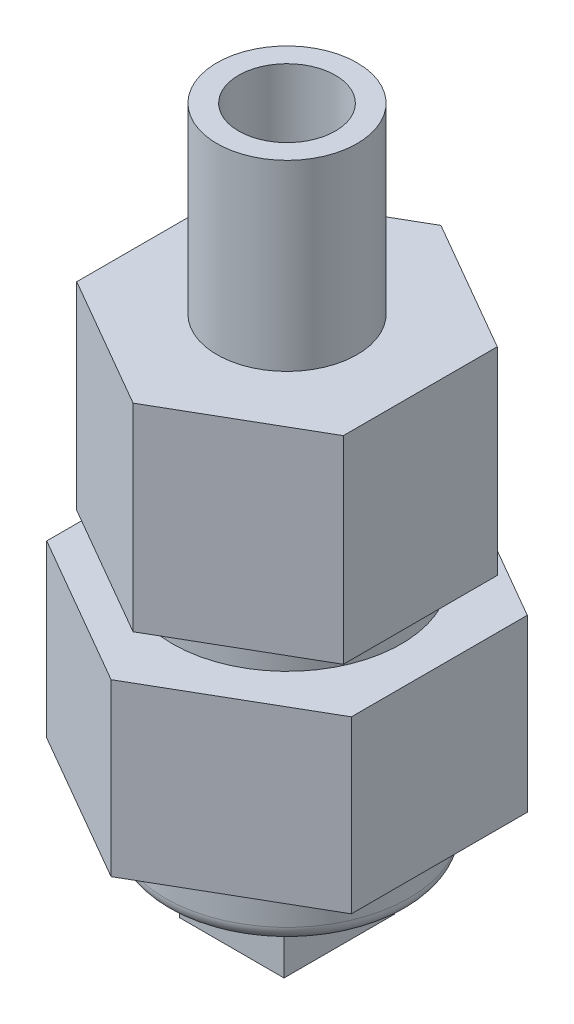
ISO-10303-21;
HEADER;
FILE_DESCRIPTION(('STEP AP214'),'2;1');
FILE_NAME('part.step','',(''),(''),'','','');
FILE_SCHEMA(('AUTOMOTIVE_DESIGN { 1 0 10303 214 1 1 1 1 }'));
ENDSEC;
DATA;
#1=APPLICATION_CONTEXT('core data for automotive mechanical design processes');
#2=APPLICATION_PROTOCOL_DEFINITION('international standard','automotive_design',2000,#1);
#3=PRODUCT_CONTEXT('',#1,'mechanical');
#4=PRODUCT('Part','Part','',(#3));
#5=PRODUCT_RELATED_PRODUCT_CATEGORY('part','',(#4));
#6=PRODUCT_DEFINITION_FORMATION('','',#4);
#7=PRODUCT_DEFINITION_CONTEXT('part definition',#1,'design');
#8=PRODUCT_DEFINITION('design','',#6,#7);
#9=PRODUCT_DEFINITION_SHAPE('','',#8);
#10=(LENGTH_UNIT() NAMED_UNIT(*) SI_UNIT(.MILLI.,.METRE.));
#11=(NAMED_UNIT(*) PLANE_ANGLE_UNIT() SI_UNIT($,.RADIAN.));
#12=(NAMED_UNIT(*) SI_UNIT($,.STERADIAN.) SOLID_ANGLE_UNIT());
#13=UNCERTAINTY_MEASURE_WITH_UNIT(LENGTH_MEASURE(1.E-05),#10,'distance_accuracy_value','');
#14=(GEOMETRIC_REPRESENTATION_CONTEXT(3) GLOBAL_UNCERTAINTY_ASSIGNED_CONTEXT((#13)) GLOBAL_UNIT_ASSIGNED_CONTEXT((#10,
#11,#12)) REPRESENTATION_CONTEXT('',''));
#15=CARTESIAN_POINT('',(0.,0.,0.));
#16=DIRECTION('',(0.,0.,1.));
#17=DIRECTION('',(1.,0.,0.));
#18=AXIS2_PLACEMENT_3D('',#15,#16,#17);
#19=CARTESIAN_POINT('',(0.,0.,0.));
#20=DIRECTION('',(0.,1.,0.));
#21=DIRECTION('',(0.,0.,1.));
#22=AXIS2_PLACEMENT_3D('',#19,#20,#21);
#23=PLANE('',#22);
#24=CARTESIAN_POINT('',(0.,0.,0.));
#25=DIRECTION('',(0.,1.,0.));
#26=DIRECTION('',(0.,0.,1.));
#27=AXIS2_PLACEMENT_3D('',#24,#25,#26);
#28=CIRCLE('',#27,8.);
#29=CARTESIAN_POINT('',(0.,0.,8.));
#30=VERTEX_POINT('',#29);
#31=EDGE_CURVE('E380',#30,#30,#28,.F.);
#32=ORIENTED_EDGE('',*,*,#31,.F.);
#33=EDGE_LOOP('',(#32));
#34=FACE_BOUND('',#33,.T.);
#35=DIRECTION('',(0.,0.,1.));
#36=VECTOR('',#35,1.);
#37=CARTESIAN_POINT('',(9.99999999999999,0.,5.77350269189626));
#38=LINE('',#37,#36);
#39=CARTESIAN_POINT('',(9.99999999999999,0.,-5.77350269189626));
#40=VERTEX_POINT('',#39);
#41=CARTESIAN_POINT('',(10.,0.,5.77350269189626));
#42=VERTEX_POINT('',#41);
#43=EDGE_CURVE('E158',#40,#42,#38,.T.);
#44=ORIENTED_EDGE('',*,*,#43,.T.);
#45=DIRECTION('',(-0.866025403784439,0.,0.5));
#46=VECTOR('',#45,1.);
#47=CARTESIAN_POINT('',(0.,0.,11.5470053837925));
#48=LINE('',#47,#46);
#49=CARTESIAN_POINT('',(0.,0.,11.5470053837925));
#50=VERTEX_POINT('',#49);
#51=EDGE_CURVE('E416',#42,#50,#48,.T.);
#52=ORIENTED_EDGE('',*,*,#51,.T.);
#53=DIRECTION('',(-0.866025403784439,0.,-0.5));
#54=VECTOR('',#53,1.);
#55=CARTESIAN_POINT('',(-10.,0.,5.77350269189626));
#56=LINE('',#55,#54);
#57=CARTESIAN_POINT('',(-10.,0.,5.77350269189626));
#58=VERTEX_POINT('',#57);
#59=EDGE_CURVE('E408',#50,#58,#56,.T.);
#60=ORIENTED_EDGE('',*,*,#59,.T.);
#61=DIRECTION('',(0.,0.,-1.));
#62=VECTOR('',#61,1.);
#63=CARTESIAN_POINT('',(-10.,0.,-5.77350269189626));
#64=LINE('',#63,#62);
#65=CARTESIAN_POINT('',(-10.,0.,-5.77350269189626));
#66=VERTEX_POINT('',#65);
#67=EDGE_CURVE('E400',#58,#66,#64,.T.);
#68=ORIENTED_EDGE('',*,*,#67,.T.);
#69=DIRECTION('',(0.866025403784439,0.,-0.5));
#70=VECTOR('',#69,1.);
#71=CARTESIAN_POINT('',(0.,0.,-11.5470053837925));
#72=LINE('',#71,#70);
#73=CARTESIAN_POINT('',(0.,0.,-11.5470053837925));
#74=VERTEX_POINT('',#73);
#75=EDGE_CURVE('E390',#66,#74,#72,.T.);
#76=ORIENTED_EDGE('',*,*,#75,.T.);
#77=DIRECTION('',(0.866025403784439,0.,0.5));
#78=VECTOR('',#77,1.);
#79=CARTESIAN_POINT('',(9.99999999999999,0.,-5.77350269189626));
#80=LINE('',#79,#78);
#81=EDGE_CURVE('E337',#74,#40,#80,.T.);
#82=ORIENTED_EDGE('',*,*,#81,.T.);
#83=EDGE_LOOP('',(#44,#52,#60,#68,#76,#82));
#84=FACE_BOUND('',#83,.T.);
#85=ADVANCED_FACE('F17',(#34,#84),#23,.F.);
#86=CARTESIAN_POINT('',(0.,-4.,0.));
#87=DIRECTION('',(0.,1.,0.));
#88=DIRECTION('',(0.,0.,1.));
#89=AXIS2_PLACEMENT_3D('',#86,#87,#88);
#90=CYLINDRICAL_SURFACE('',#89,8.);
#91=CARTESIAN_POINT('',(0.,-3.,0.));
#92=DIRECTION('',(0.,-1.,0.));
#93=DIRECTION('',(0.,0.,-1.));
#94=AXIS2_PLACEMENT_3D('',#91,#92,#93);
#95=CIRCLE('',#94,8.);
#96=CARTESIAN_POINT('',(0.,-3.,-8.));
#97=VERTEX_POINT('',#96);
#98=EDGE_CURVE('E325',#97,#97,#95,.T.);
#99=ORIENTED_EDGE('',*,*,#98,.F.);
#100=EDGE_LOOP('',(#99));
#101=FACE_BOUND('',#100,.T.);
#102=ORIENTED_EDGE('',*,*,#31,.T.);
#103=EDGE_LOOP('',(#102));
#104=FACE_BOUND('',#103,.T.);
#105=ADVANCED_FACE('F195',(#101,#104),#90,.T.);
#106=CARTESIAN_POINT('',(9.99999999999999,11.2,-5.77350269189626));
#107=DIRECTION('',(-0.5,0.,0.866025403784439));
#108=DIRECTION('',(0.866025403784439,0.,0.5));
#109=AXIS2_PLACEMENT_3D('',#106,#107,#108);
#110=PLANE('',#109);
#111=DIRECTION('',(0.,1.,0.));
#112=VECTOR('',#111,1.);
#113=CARTESIAN_POINT('',(0.,11.2,-11.5470053837925));
#114=LINE('',#113,#112);
#115=CARTESIAN_POINT('',(0.,11.2,-11.5470053837925));
#116=VERTEX_POINT('',#115);
#117=EDGE_CURVE('E385',#74,#116,#114,.T.);
#118=ORIENTED_EDGE('',*,*,#117,.T.);
#119=DIRECTION('',(-0.866025403784439,0.,-0.5));
#120=VECTOR('',#119,1.);
#121=CARTESIAN_POINT('',(9.99999999999999,11.2,-5.77350269189626));
#122=LINE('',#121,#120);
#123=CARTESIAN_POINT('',(9.99999999999999,11.2,-5.77350269189626));
#124=VERTEX_POINT('',#123);
#125=EDGE_CURVE('E323',#124,#116,#122,.T.);
#126=ORIENTED_EDGE('',*,*,#125,.F.);
#127=DIRECTION('',(0.,1.,0.));
#128=VECTOR('',#127,1.);
#129=CARTESIAN_POINT('',(9.99999999999999,11.2,-5.77350269189626));
#130=LINE('',#129,#128);
#131=EDGE_CURVE('E335',#124,#40,#130,.F.);
#132=ORIENTED_EDGE('',*,*,#131,.T.);
#133=ORIENTED_EDGE('',*,*,#81,.F.);
#134=EDGE_LOOP('',(#118,#126,#132,#133));
#135=FACE_BOUND('',#134,.T.);
#136=ADVANCED_FACE('F192',(#135),#110,.F.);
#137=CARTESIAN_POINT('',(0.,11.2,-11.5470053837925));
#138=DIRECTION('',(0.5,0.,0.866025403784439));
#139=DIRECTION('',(0.866025403784439,0.,-0.5));
#140=AXIS2_PLACEMENT_3D('',#137,#138,#139);
#141=PLANE('',#140);
#142=DIRECTION('',(0.,1.,0.));
#143=VECTOR('',#142,1.);
#144=CARTESIAN_POINT('',(-10.,11.2,-5.77350269189626));
#145=LINE('',#144,#143);
#146=CARTESIAN_POINT('',(-10.,11.2,-5.77350269189626));
#147=VERTEX_POINT('',#146);
#148=EDGE_CURVE('E394',#66,#147,#145,.T.);
#149=ORIENTED_EDGE('',*,*,#148,.T.);
#150=DIRECTION('',(-0.866025403784438,0.,0.5));
#151=VECTOR('',#150,1.);
#152=CARTESIAN_POINT('',(0.,11.2,-11.5470053837925));
#153=LINE('',#152,#151);
#154=EDGE_CURVE('E321',#116,#147,#153,.T.);
#155=ORIENTED_EDGE('',*,*,#154,.F.);
#156=ORIENTED_EDGE('',*,*,#117,.F.);
#157=ORIENTED_EDGE('',*,*,#75,.F.);
#158=EDGE_LOOP('',(#149,#155,#156,#157));
#159=FACE_BOUND('',#158,.T.);
#160=ADVANCED_FACE('F188',(#159),#141,.F.);
#161=CARTESIAN_POINT('',(-10.,11.2,-5.77350269189626));
#162=DIRECTION('',(1.,0.,0.));
#163=DIRECTION('',(0.,0.,-1.));
#164=AXIS2_PLACEMENT_3D('',#161,#162,#163);
#165=PLANE('',#164);
#166=DIRECTION('',(0.,1.,0.));
#167=VECTOR('',#166,1.);
#168=CARTESIAN_POINT('',(-10.,11.2,5.77350269189626));
#169=LINE('',#168,#167);
#170=CARTESIAN_POINT('',(-10.,11.2,5.77350269189626));
#171=VERTEX_POINT('',#170);
#172=EDGE_CURVE('E404',#58,#171,#169,.T.);
#173=ORIENTED_EDGE('',*,*,#172,.T.);
#174=DIRECTION('',(0.,0.,1.));
#175=VECTOR('',#174,1.);
#176=CARTESIAN_POINT('',(-10.,11.2,0.));
#177=LINE('',#176,#175);
#178=EDGE_CURVE('E318',#147,#171,#177,.T.);
#179=ORIENTED_EDGE('',*,*,#178,.F.);
#180=ORIENTED_EDGE('',*,*,#148,.F.);
#181=ORIENTED_EDGE('',*,*,#67,.F.);
#182=EDGE_LOOP('',(#173,#179,#180,#181));
#183=FACE_BOUND('',#182,.T.);
#184=ADVANCED_FACE('F184',(#183),#165,.F.);
#185=CARTESIAN_POINT('',(-10.,11.2,5.77350269189626));
#186=DIRECTION('',(0.5,0.,-0.866025403784439));
#187=DIRECTION('',(-0.866025403784439,0.,-0.5));
#188=AXIS2_PLACEMENT_3D('',#185,#186,#187);
#189=PLANE('',#188);
#190=DIRECTION('',(0.,1.,0.));
#191=VECTOR('',#190,1.);
#192=CARTESIAN_POINT('',(0.,11.2,11.5470053837925));
#193=LINE('',#192,#191);
#194=CARTESIAN_POINT('',(0.,11.2,11.5470053837925));
#195=VERTEX_POINT('',#194);
#196=EDGE_CURVE('E412',#50,#195,#193,.T.);
#197=ORIENTED_EDGE('',*,*,#196,.T.);
#198=DIRECTION('',(0.866025403784439,0.,0.5));
#199=VECTOR('',#198,1.);
#200=CARTESIAN_POINT('',(-10.,11.2,5.77350269189626));
#201=LINE('',#200,#199);
#202=EDGE_CURVE('E315',#171,#195,#201,.T.);
#203=ORIENTED_EDGE('',*,*,#202,.F.);
#204=ORIENTED_EDGE('',*,*,#172,.F.);
#205=ORIENTED_EDGE('',*,*,#59,.F.);
#206=EDGE_LOOP('',(#197,#203,#204,#205));
#207=FACE_BOUND('',#206,.T.);
#208=ADVANCED_FACE('F180',(#207),#189,.F.);
#209=CARTESIAN_POINT('',(0.,11.2,11.5470053837925));
#210=DIRECTION('',(-0.5,0.,-0.866025403784439));
#211=DIRECTION('',(-0.866025403784439,0.,0.5));
#212=AXIS2_PLACEMENT_3D('',#209,#210,#211);
#213=PLANE('',#212);
#214=DIRECTION('',(0.,1.,0.));
#215=VECTOR('',#214,1.);
#216=CARTESIAN_POINT('',(9.99999999999999,11.2,5.77350269189626));
#217=LINE('',#216,#215);
#218=CARTESIAN_POINT('',(9.99999999999999,11.2,5.77350269189626));
#219=VERTEX_POINT('',#218);
#220=EDGE_CURVE('E420',#42,#219,#217,.T.);
#221=ORIENTED_EDGE('',*,*,#220,.T.);
#222=DIRECTION('',(0.866025403784438,0.,-0.5));
#223=VECTOR('',#222,1.);
#224=CARTESIAN_POINT('',(0.,11.2,11.5470053837925));
#225=LINE('',#224,#223);
#226=EDGE_CURVE('E312',#195,#219,#225,.T.);
#227=ORIENTED_EDGE('',*,*,#226,.F.);
#228=ORIENTED_EDGE('',*,*,#196,.F.);
#229=ORIENTED_EDGE('',*,*,#51,.F.);
#230=EDGE_LOOP('',(#221,#227,#228,#229));
#231=FACE_BOUND('',#230,.T.);
#232=ADVANCED_FACE('F176',(#231),#213,.F.);
#233=CARTESIAN_POINT('',(9.99999999999999,11.2,5.77350269189626));
#234=DIRECTION('',(-1.,0.,0.));
#235=DIRECTION('',(0.,0.,1.));
#236=AXIS2_PLACEMENT_3D('',#233,#234,#235);
#237=PLANE('',#236);
#238=ORIENTED_EDGE('',*,*,#131,.F.);
#239=DIRECTION('',(0.,0.,1.));
#240=VECTOR('',#239,1.);
#241=CARTESIAN_POINT('',(9.99999999999999,11.2,0.));
#242=LINE('',#241,#240);
#243=EDGE_CURVE('E144',#219,#124,#242,.F.);
#244=ORIENTED_EDGE('',*,*,#243,.F.);
#245=ORIENTED_EDGE('',*,*,#220,.F.);
#246=ORIENTED_EDGE('',*,*,#43,.F.);
#247=EDGE_LOOP('',(#238,#244,#245,#246));
#248=FACE_BOUND('',#247,.T.);
#249=ADVANCED_FACE('F170',(#248),#237,.F.);
#250=CARTESIAN_POINT('',(0.,-3.,0.));
#251=DIRECTION('',(0.,-1.,0.));
#252=DIRECTION('',(0.,0.,-1.));
#253=AXIS2_PLACEMENT_3D('',#250,#251,#252);
#254=TOROIDAL_SURFACE('',#253,7.,1.);
#255=ORIENTED_EDGE('',*,*,#98,.T.);
#256=EDGE_LOOP('',(#255));
#257=FACE_BOUND('',#256,.T.);
#258=CARTESIAN_POINT('',(0.,-4.,0.));
#259=DIRECTION('',(0.,1.,0.));
#260=DIRECTION('',(0.,0.,-1.));
#261=AXIS2_PLACEMENT_3D('',#258,#259,#260);
#262=CIRCLE('',#261,7.);
#263=CARTESIAN_POINT('',(0.,-4.,7.));
#264=VERTEX_POINT('',#263);
#265=CARTESIAN_POINT('',(0.,-4.,-7.));
#266=VERTEX_POINT('',#265);
#267=EDGE_CURVE('E136',#264,#266,#262,.F.);
#268=ORIENTED_EDGE('',*,*,#267,.F.);
#269=CARTESIAN_POINT('',(0.,-4.,0.));
#270=DIRECTION('',(0.,1.,0.));
#271=DIRECTION('',(0.,0.,1.));
#272=AXIS2_PLACEMENT_3D('',#269,#270,#271);
#273=CIRCLE('',#272,7.);
#274=EDGE_CURVE('E139',#266,#264,#273,.F.);
#275=ORIENTED_EDGE('',*,*,#274,.F.);
#276=EDGE_LOOP('',(#268,#275));
#277=FACE_BOUND('',#276,.T.);
#278=ADVANCED_FACE('F148',(#257,#277),#254,.T.);
#279=CARTESIAN_POINT('',(0.,11.2,0.));
#280=DIRECTION('',(0.,1.,0.));
#281=DIRECTION('',(0.,0.,1.));
#282=AXIS2_PLACEMENT_3D('',#279,#280,#281);
#283=PLANE('',#282);
#284=CARTESIAN_POINT('',(0.,11.2,0.));
#285=DIRECTION('',(0.,-1.,0.));
#286=DIRECTION('',(0.,0.,-1.));
#287=AXIS2_PLACEMENT_3D('',#284,#285,#286);
#288=CIRCLE('',#287,7.5);
#289=CARTESIAN_POINT('',(0.,11.2,-7.5));
#290=VERTEX_POINT('',#289);
#291=EDGE_CURVE('E150',#290,#290,#288,.F.);
#292=ORIENTED_EDGE('',*,*,#291,.F.);
#293=EDGE_LOOP('',(#292));
#294=FACE_BOUND('',#293,.T.);
#295=ORIENTED_EDGE('',*,*,#226,.T.);
#296=ORIENTED_EDGE('',*,*,#243,.T.);
#297=ORIENTED_EDGE('',*,*,#125,.T.);
#298=ORIENTED_EDGE('',*,*,#154,.T.);
#299=ORIENTED_EDGE('',*,*,#178,.T.);
#300=ORIENTED_EDGE('',*,*,#202,.T.);
#301=EDGE_LOOP('',(#295,#296,#297,#298,#299,#300));
#302=FACE_BOUND('',#301,.T.);
#303=ADVANCED_FACE('F169',(#294,#302),#283,.T.);
#304=CARTESIAN_POINT('',(0.,-4.,0.));
#305=DIRECTION('',(0.,-1.,0.));
#306=DIRECTION('',(0.,0.,-1.));
#307=AXIS2_PLACEMENT_3D('',#304,#305,#306);
#308=PLANE('',#307);
#309=DIRECTION('',(-1.,0.,0.));
#310=VECTOR('',#309,1.);
#311=CARTESIAN_POINT('',(3.43638652434224,-4.,3.63197572339341));
#312=LINE('',#311,#310);
#313=CARTESIAN_POINT('',(-3.43638652434224,-4.,3.63197572339341));
#314=VERTEX_POINT('',#313);
#315=CARTESIAN_POINT('',(3.43638652434224,-4.,3.63197572339341));
#316=VERTEX_POINT('',#315);
#317=EDGE_CURVE('E375',#314,#316,#312,.F.);
#318=ORIENTED_EDGE('',*,*,#317,.T.);
#319=DIRECTION('',(0.,0.,1.));
#320=VECTOR('',#319,1.);
#321=CARTESIAN_POINT('',(3.43638652434224,-4.,-3.63197572339341));
#322=LINE('',#321,#320);
#323=CARTESIAN_POINT('',(3.43638652434224,-4.,-3.63197572339341));
#324=VERTEX_POINT('',#323);
#325=EDGE_CURVE('E655',#316,#324,#322,.F.);
#326=ORIENTED_EDGE('',*,*,#325,.T.);
#327=DIRECTION('',(1.,0.,0.));
#328=VECTOR('',#327,1.);
#329=CARTESIAN_POINT('',(3.43638652434224,-4.,-3.63197572339341));
#330=LINE('',#329,#328);
#331=CARTESIAN_POINT('',(-3.43638652434224,-4.,-3.63197572339341));
#332=VERTEX_POINT('',#331);
#333=EDGE_CURVE('E646',#324,#332,#330,.F.);
#334=ORIENTED_EDGE('',*,*,#333,.T.);
#335=DIRECTION('',(0.,0.,-1.));
#336=VECTOR('',#335,1.);
#337=CARTESIAN_POINT('',(-3.43638652434224,-4.,-3.63197572339341));
#338=LINE('',#337,#336);
#339=EDGE_CURVE('E379',#332,#314,#338,.F.);
#340=ORIENTED_EDGE('',*,*,#339,.T.);
#341=EDGE_LOOP('',(#318,#326,#334,#340));
#342=FACE_BOUND('',#341,.T.);
#343=ORIENTED_EDGE('',*,*,#274,.T.);
#344=ORIENTED_EDGE('',*,*,#267,.T.);
#345=EDGE_LOOP('',(#343,#344));
#346=FACE_BOUND('',#345,.T.);
#347=ADVANCED_FACE('F141',(#342,#346),#308,.T.);
#348=CARTESIAN_POINT('',(0.,13.2,0.));
#349=DIRECTION('',(0.,-1.,0.));
#350=DIRECTION('',(0.,0.,-1.));
#351=AXIS2_PLACEMENT_3D('',#348,#349,#350);
#352=CYLINDRICAL_SURFACE('',#351,7.5);
#353=CARTESIAN_POINT('',(0.,13.2,0.));
#354=DIRECTION('',(0.,-1.,0.));
#355=DIRECTION('',(0.,0.,-1.));
#356=AXIS2_PLACEMENT_3D('',#353,#354,#355);
#357=CIRCLE('',#356,7.5);
#358=CARTESIAN_POINT('',(0.,13.2,-7.5));
#359=VERTEX_POINT('',#358);
#360=EDGE_CURVE('E370',#359,#359,#357,.T.);
#361=ORIENTED_EDGE('',*,*,#360,.T.);
#362=EDGE_LOOP('',(#361));
#363=FACE_BOUND('',#362,.T.);
#364=ORIENTED_EDGE('',*,*,#291,.T.);
#365=EDGE_LOOP('',(#364));
#366=FACE_BOUND('',#365,.T.);
#367=ADVANCED_FACE('F290',(#363,#366),#352,.T.);
#368=CARTESIAN_POINT('',(-3.43638652434224,-8.,-3.63197572339341));
#369=DIRECTION('',(1.,0.,0.));
#370=DIRECTION('',(0.,0.,-1.));
#371=AXIS2_PLACEMENT_3D('',#368,#369,#370);
#372=PLANE('',#371);
#373=DIRECTION('',(0.,1.,0.));
#374=VECTOR('',#373,1.);
#375=CARTESIAN_POINT('',(-3.43638652434224,-8.,-3.63197572339341));
#376=LINE('',#375,#374);
#377=CARTESIAN_POINT('',(-3.43638652434224,-8.,-3.63197572339341));
#378=VERTEX_POINT('',#377);
#379=EDGE_CURVE('E640',#332,#378,#376,.F.);
#380=ORIENTED_EDGE('',*,*,#379,.T.);
#381=DIRECTION('',(0.,0.,-1.));
#382=VECTOR('',#381,1.);
#383=CARTESIAN_POINT('',(-3.43638652434224,-8.,0.));
#384=LINE('',#383,#382);
#385=CARTESIAN_POINT('',(-3.43638652434224,-8.,3.63197572339341));
#386=VERTEX_POINT('',#385);
#387=EDGE_CURVE('E374',#386,#378,#384,.T.);
#388=ORIENTED_EDGE('',*,*,#387,.F.);
#389=DIRECTION('',(0.,1.,0.));
#390=VECTOR('',#389,1.);
#391=CARTESIAN_POINT('',(-3.43638652434224,-8.,3.63197572339341));
#392=LINE('',#391,#390);
#393=EDGE_CURVE('E663',#386,#314,#392,.T.);
#394=ORIENTED_EDGE('',*,*,#393,.T.);
#395=ORIENTED_EDGE('',*,*,#339,.F.);
#396=EDGE_LOOP('',(#380,#388,#394,#395));
#397=FACE_BOUND('',#396,.T.);
#398=ADVANCED_FACE('F286',(#397),#372,.F.);
#399=CARTESIAN_POINT('',(3.43638652434224,-8.,-3.63197572339341));
#400=DIRECTION('',(0.,0.,1.));
#401=DIRECTION('',(1.,0.,0.));
#402=AXIS2_PLACEMENT_3D('',#399,#400,#401);
#403=PLANE('',#402);
#404=DIRECTION('',(0.,1.,0.));
#405=VECTOR('',#404,1.);
#406=CARTESIAN_POINT('',(3.43638652434224,-8.,-3.63197572339341));
#407=LINE('',#406,#405);
#408=CARTESIAN_POINT('',(3.43638652434224,-8.,-3.63197572339341));
#409=VERTEX_POINT('',#408);
#410=EDGE_CURVE('E651',#324,#409,#407,.F.);
#411=ORIENTED_EDGE('',*,*,#410,.T.);
#412=DIRECTION('',(1.,0.,0.));
#413=VECTOR('',#412,1.);
#414=CARTESIAN_POINT('',(0.,-8.,-3.63197572339341));
#415=LINE('',#414,#413);
#416=EDGE_CURVE('E671',#378,#409,#415,.T.);
#417=ORIENTED_EDGE('',*,*,#416,.F.);
#418=ORIENTED_EDGE('',*,*,#379,.F.);
#419=ORIENTED_EDGE('',*,*,#333,.F.);
#420=EDGE_LOOP('',(#411,#417,#418,#419));
#421=FACE_BOUND('',#420,.T.);
#422=ADVANCED_FACE('F282',(#421),#403,.F.);
#423=CARTESIAN_POINT('',(3.43638652434224,-8.,-3.63197572339341));
#424=DIRECTION('',(-1.,0.,0.));
#425=DIRECTION('',(0.,0.,1.));
#426=AXIS2_PLACEMENT_3D('',#423,#424,#425);
#427=PLANE('',#426);
#428=DIRECTION('',(0.,1.,0.));
#429=VECTOR('',#428,1.);
#430=CARTESIAN_POINT('',(3.43638652434224,-8.,3.63197572339341));
#431=LINE('',#430,#429);
#432=CARTESIAN_POINT('',(3.43638652434224,-8.,3.63197572339341));
#433=VERTEX_POINT('',#432);
#434=EDGE_CURVE('E659',#316,#433,#431,.F.);
#435=ORIENTED_EDGE('',*,*,#434,.T.);
#436=DIRECTION('',(0.,0.,-1.));
#437=VECTOR('',#436,1.);
#438=CARTESIAN_POINT('',(3.43638652434224,-8.,0.));
#439=LINE('',#438,#437);
#440=EDGE_CURVE('E674',#409,#433,#439,.F.);
#441=ORIENTED_EDGE('',*,*,#440,.F.);
#442=ORIENTED_EDGE('',*,*,#410,.F.);
#443=ORIENTED_EDGE('',*,*,#325,.F.);
#444=EDGE_LOOP('',(#435,#441,#442,#443));
#445=FACE_BOUND('',#444,.T.);
#446=ADVANCED_FACE('F278',(#445),#427,.F.);
#447=CARTESIAN_POINT('',(3.43638652434224,-8.,3.63197572339341));
#448=DIRECTION('',(0.,0.,-1.));
#449=DIRECTION('',(-1.,0.,0.));
#450=AXIS2_PLACEMENT_3D('',#447,#448,#449);
#451=PLANE('',#450);
#452=ORIENTED_EDGE('',*,*,#393,.F.);
#453=DIRECTION('',(1.,0.,0.));
#454=VECTOR('',#453,1.);
#455=CARTESIAN_POINT('',(0.,-8.,3.63197572339341));
#456=LINE('',#455,#454);
#457=EDGE_CURVE('E677',#433,#386,#456,.F.);
#458=ORIENTED_EDGE('',*,*,#457,.F.);
#459=ORIENTED_EDGE('',*,*,#434,.F.);
#460=ORIENTED_EDGE('',*,*,#317,.F.);
#461=EDGE_LOOP('',(#452,#458,#459,#460));
#462=FACE_BOUND('',#461,.T.);
#463=ADVANCED_FACE('F274',(#462),#451,.F.);
#464=CARTESIAN_POINT('',(0.,13.2,0.));
#465=DIRECTION('',(0.,1.,0.));
#466=DIRECTION('',(0.,0.,1.));
#467=AXIS2_PLACEMENT_3D('',#464,#465,#466);
#468=PLANE('',#467);
#469=ORIENTED_EDGE('',*,*,#360,.F.);
#470=EDGE_LOOP('',(#469));
#471=FACE_BOUND('',#470,.T.);
#472=DIRECTION('',(0.,0.,1.));
#473=VECTOR('',#472,1.);
#474=CARTESIAN_POINT('',(8.75,13.2,5.05181485540923));
#475=LINE('',#474,#473);
#476=CARTESIAN_POINT('',(8.75,13.2,-5.05181485540923));
#477=VERTEX_POINT('',#476);
#478=CARTESIAN_POINT('',(8.75,13.2,5.05181485540923));
#479=VERTEX_POINT('',#478);
#480=EDGE_CURVE('E369',#477,#479,#475,.T.);
#481=ORIENTED_EDGE('',*,*,#480,.T.);
#482=DIRECTION('',(-0.866025403784439,0.,0.5));
#483=VECTOR('',#482,1.);
#484=CARTESIAN_POINT('',(0.,13.2,10.1036297108185));
#485=LINE('',#484,#483);
#486=CARTESIAN_POINT('',(0.,13.2,10.1036297108185));
#487=VERTEX_POINT('',#486);
#488=EDGE_CURVE('E712',#479,#487,#485,.T.);
#489=ORIENTED_EDGE('',*,*,#488,.T.);
#490=DIRECTION('',(-0.866025403784439,0.,-0.5));
#491=VECTOR('',#490,1.);
#492=CARTESIAN_POINT('',(-8.75,13.2,5.05181485540923));
#493=LINE('',#492,#491);
#494=CARTESIAN_POINT('',(-8.75,13.2,5.05181485540923));
#495=VERTEX_POINT('',#494);
#496=EDGE_CURVE('E704',#487,#495,#493,.T.);
#497=ORIENTED_EDGE('',*,*,#496,.T.);
#498=DIRECTION('',(0.,0.,-1.));
#499=VECTOR('',#498,1.);
#500=CARTESIAN_POINT('',(-8.75,13.2,-5.05181485540923));
#501=LINE('',#500,#499);
#502=CARTESIAN_POINT('',(-8.75,13.2,-5.05181485540923));
#503=VERTEX_POINT('',#502);
#504=EDGE_CURVE('E696',#495,#503,#501,.T.);
#505=ORIENTED_EDGE('',*,*,#504,.T.);
#506=DIRECTION('',(0.866025403784439,0.,-0.5));
#507=VECTOR('',#506,1.);
#508=CARTESIAN_POINT('',(0.,13.2,-10.1036297108185));
#509=LINE('',#508,#507);
#510=CARTESIAN_POINT('',(0.,13.2,-10.1036297108185));
#511=VERTEX_POINT('',#510);
#512=EDGE_CURVE('E688',#503,#511,#509,.T.);
#513=ORIENTED_EDGE('',*,*,#512,.T.);
#514=DIRECTION('',(0.866025403784439,0.,0.5));
#515=VECTOR('',#514,1.);
#516=CARTESIAN_POINT('',(8.74999999999999,13.2,-5.05181485540923));
#517=LINE('',#516,#515);
#518=EDGE_CURVE('E681',#511,#477,#517,.T.);
#519=ORIENTED_EDGE('',*,*,#518,.T.);
#520=EDGE_LOOP('',(#481,#489,#497,#505,#513,#519));
#521=FACE_BOUND('',#520,.T.);
#522=ADVANCED_FACE('F270',(#471,#521),#468,.F.);
#523=CARTESIAN_POINT('',(0.,-8.,0.));
#524=DIRECTION('',(0.,-1.,0.));
#525=DIRECTION('',(0.,0.,-1.));
#526=AXIS2_PLACEMENT_3D('',#523,#524,#525);
#527=PLANE('',#526);
#528=ORIENTED_EDGE('',*,*,#440,.T.);
#529=ORIENTED_EDGE('',*,*,#457,.T.);
#530=ORIENTED_EDGE('',*,*,#387,.T.);
#531=ORIENTED_EDGE('',*,*,#416,.T.);
#532=EDGE_LOOP('',(#528,#529,#530,#531));
#533=FACE_BOUND('',#532,.T.);
#534=CARTESIAN_POINT('',(0.,-8.,0.));
#535=DIRECTION('',(0.,-1.,0.));
#536=DIRECTION('',(0.,0.,-1.));
#537=AXIS2_PLACEMENT_3D('',#534,#535,#536);
#538=CIRCLE('',#537,0.5969);
#539=CARTESIAN_POINT('',(0.,-8.,-0.5969));
#540=VERTEX_POINT('',#539);
#541=EDGE_CURVE('E364',#540,#540,#538,.F.);
#542=ORIENTED_EDGE('',*,*,#541,.T.);
#543=EDGE_LOOP('',(#542));
#544=FACE_BOUND('',#543,.T.);
#545=ADVANCED_FACE('F266',(#533,#544),#527,.T.);
#546=CARTESIAN_POINT('',(8.74999999999999,26.2,-5.05181485540923));
#547=DIRECTION('',(-0.5,0.,0.866025403784439));
#548=DIRECTION('',(0.866025403784439,0.,0.5));
#549=AXIS2_PLACEMENT_3D('',#546,#547,#548);
#550=PLANE('',#549);
#551=DIRECTION('',(0.,1.,0.));
#552=VECTOR('',#551,1.);
#553=CARTESIAN_POINT('',(0.,26.2,-10.1036297108185));
#554=LINE('',#553,#552);
#555=CARTESIAN_POINT('',(0.,26.2,-10.1036297108185));
#556=VERTEX_POINT('',#555);
#557=EDGE_CURVE('E684',#511,#556,#554,.T.);
#558=ORIENTED_EDGE('',*,*,#557,.T.);
#559=DIRECTION('',(-0.866025403784439,0.,-0.5));
#560=VECTOR('',#559,1.);
#561=CARTESIAN_POINT('',(8.74999999999999,26.2,-5.05181485540923));
#562=LINE('',#561,#560);
#563=CARTESIAN_POINT('',(8.75,26.2,-5.05181485540923));
#564=VERTEX_POINT('',#563);
#565=EDGE_CURVE('E368',#564,#556,#562,.T.);
#566=ORIENTED_EDGE('',*,*,#565,.F.);
#567=DIRECTION('',(0.,1.,0.));
#568=VECTOR('',#567,1.);
#569=CARTESIAN_POINT('',(8.74999999999999,26.2,-5.05181485540923));
#570=LINE('',#569,#568);
#571=EDGE_CURVE('E719',#564,#477,#570,.F.);
#572=ORIENTED_EDGE('',*,*,#571,.T.);
#573=ORIENTED_EDGE('',*,*,#518,.F.);
#574=EDGE_LOOP('',(#558,#566,#572,#573));
#575=FACE_BOUND('',#574,.T.);
#576=ADVANCED_FACE('F262',(#575),#550,.F.);
#577=CARTESIAN_POINT('',(0.,26.2,-10.1036297108185));
#578=DIRECTION('',(0.5,0.,0.866025403784439));
#579=DIRECTION('',(0.866025403784439,0.,-0.5));
#580=AXIS2_PLACEMENT_3D('',#577,#578,#579);
#581=PLANE('',#580);
#582=DIRECTION('',(0.,1.,0.));
#583=VECTOR('',#582,1.);
#584=CARTESIAN_POINT('',(-8.75,26.2,-5.05181485540923));
#585=LINE('',#584,#583);
#586=CARTESIAN_POINT('',(-8.75,26.2,-5.05181485540923));
#587=VERTEX_POINT('',#586);
#588=EDGE_CURVE('E692',#503,#587,#585,.T.);
#589=ORIENTED_EDGE('',*,*,#588,.T.);
#590=DIRECTION('',(-0.866025403784439,0.,0.5));
#591=VECTOR('',#590,1.);
#592=CARTESIAN_POINT('',(0.,26.2,-10.1036297108185));
#593=LINE('',#592,#591);
#594=EDGE_CURVE('E728',#556,#587,#593,.T.);
#595=ORIENTED_EDGE('',*,*,#594,.F.);
#596=ORIENTED_EDGE('',*,*,#557,.F.);
#597=ORIENTED_EDGE('',*,*,#512,.F.);
#598=EDGE_LOOP('',(#589,#595,#596,#597));
#599=FACE_BOUND('',#598,.T.);
#600=ADVANCED_FACE('F258',(#599),#581,.F.);
#601=CARTESIAN_POINT('',(-8.75,26.2,-5.05181485540923));
#602=DIRECTION('',(1.,0.,0.));
#603=DIRECTION('',(0.,0.,-1.));
#604=AXIS2_PLACEMENT_3D('',#601,#602,#603);
#605=PLANE('',#604);
#606=DIRECTION('',(0.,1.,0.));
#607=VECTOR('',#606,1.);
#608=CARTESIAN_POINT('',(-8.75,26.2,5.05181485540923));
#609=LINE('',#608,#607);
#610=CARTESIAN_POINT('',(-8.75,26.2,5.05181485540923));
#611=VERTEX_POINT('',#610);
#612=EDGE_CURVE('E700',#495,#611,#609,.T.);
#613=ORIENTED_EDGE('',*,*,#612,.T.);
#614=DIRECTION('',(0.,0.,1.));
#615=VECTOR('',#614,1.);
#616=CARTESIAN_POINT('',(-8.75,26.2,0.));
#617=LINE('',#616,#615);
#618=EDGE_CURVE('E731',#587,#611,#617,.T.);
#619=ORIENTED_EDGE('',*,*,#618,.F.);
#620=ORIENTED_EDGE('',*,*,#588,.F.);
#621=ORIENTED_EDGE('',*,*,#504,.F.);
#622=EDGE_LOOP('',(#613,#619,#620,#621));
#623=FACE_BOUND('',#622,.T.);
#624=ADVANCED_FACE('F254',(#623),#605,.F.);
#625=CARTESIAN_POINT('',(-8.75,26.2,5.05181485540923));
#626=DIRECTION('',(0.5,0.,-0.866025403784439));
#627=DIRECTION('',(-0.866025403784439,0.,-0.5));
#628=AXIS2_PLACEMENT_3D('',#625,#626,#627);
#629=PLANE('',#628);
#630=DIRECTION('',(0.,1.,0.));
#631=VECTOR('',#630,1.);
#632=CARTESIAN_POINT('',(0.,26.2,10.1036297108185));
#633=LINE('',#632,#631);
#634=CARTESIAN_POINT('',(0.,26.2,10.1036297108185));
#635=VERTEX_POINT('',#634);
#636=EDGE_CURVE('E708',#487,#635,#633,.T.);
#637=ORIENTED_EDGE('',*,*,#636,.T.);
#638=DIRECTION('',(0.866025403784439,0.,0.5));
#639=VECTOR('',#638,1.);
#640=CARTESIAN_POINT('',(-8.75,26.2,5.05181485540923));
#641=LINE('',#640,#639);
#642=EDGE_CURVE('E734',#611,#635,#641,.T.);
#643=ORIENTED_EDGE('',*,*,#642,.F.);
#644=ORIENTED_EDGE('',*,*,#612,.F.);
#645=ORIENTED_EDGE('',*,*,#496,.F.);
#646=EDGE_LOOP('',(#637,#643,#644,#645));
#647=FACE_BOUND('',#646,.T.);
#648=ADVANCED_FACE('F250',(#647),#629,.F.);
#649=CARTESIAN_POINT('',(0.,26.2,10.1036297108185));
#650=DIRECTION('',(-0.5,0.,-0.866025403784439));
#651=DIRECTION('',(-0.866025403784439,0.,0.5));
#652=AXIS2_PLACEMENT_3D('',#649,#650,#651);
#653=PLANE('',#652);
#654=DIRECTION('',(0.,1.,0.));
#655=VECTOR('',#654,1.);
#656=CARTESIAN_POINT('',(8.75,26.2,5.05181485540923));
#657=LINE('',#656,#655);
#658=CARTESIAN_POINT('',(8.75,26.2,5.05181485540923));
#659=VERTEX_POINT('',#658);
#660=EDGE_CURVE('E716',#479,#659,#657,.T.);
#661=ORIENTED_EDGE('',*,*,#660,.T.);
#662=DIRECTION('',(0.866025403784438,0.,-0.5));
#663=VECTOR('',#662,1.);
#664=CARTESIAN_POINT('',(0.,26.2,10.1036297108185));
#665=LINE('',#664,#663);
#666=EDGE_CURVE('E38',#635,#659,#665,.T.);
#667=ORIENTED_EDGE('',*,*,#666,.F.);
#668=ORIENTED_EDGE('',*,*,#636,.F.);
#669=ORIENTED_EDGE('',*,*,#488,.F.);
#670=EDGE_LOOP('',(#661,#667,#668,#669));
#671=FACE_BOUND('',#670,.T.);
#672=ADVANCED_FACE('F246',(#671),#653,.F.);
#673=CARTESIAN_POINT('',(8.75,26.2,5.05181485540923));
#674=DIRECTION('',(-1.,0.,0.));
#675=DIRECTION('',(0.,0.,1.));
#676=AXIS2_PLACEMENT_3D('',#673,#674,#675);
#677=PLANE('',#676);
#678=ORIENTED_EDGE('',*,*,#571,.F.);
#679=DIRECTION('',(0.,0.,1.));
#680=VECTOR('',#679,1.);
#681=CARTESIAN_POINT('',(8.75,26.2,0.));
#682=LINE('',#681,#680);
#683=EDGE_CURVE('E363',#659,#564,#682,.F.);
#684=ORIENTED_EDGE('',*,*,#683,.F.);
#685=ORIENTED_EDGE('',*,*,#660,.F.);
#686=ORIENTED_EDGE('',*,*,#480,.F.);
#687=EDGE_LOOP('',(#678,#684,#685,#686));
#688=FACE_BOUND('',#687,.T.);
#689=ADVANCED_FACE('F242',(#688),#677,.F.);
#690=CARTESIAN_POINT('',(0.,17.,0.));
#691=DIRECTION('',(0.,-1.,0.));
#692=DIRECTION('',(0.,0.,-1.));
#693=AXIS2_PLACEMENT_3D('',#690,#691,#692);
#694=CYLINDRICAL_SURFACE('',#693,0.5969);
#695=ORIENTED_EDGE('',*,*,#541,.F.);
#696=EDGE_LOOP('',(#695));
#697=FACE_BOUND('',#696,.T.);
#698=CARTESIAN_POINT('',(0.,-3.80000000000002,0.));
#699=DIRECTION('',(0.,-1.,0.));
#700=DIRECTION('',(0.,0.,-1.));
#701=AXIS2_PLACEMENT_3D('',#698,#699,#700);
#702=CIRCLE('',#701,0.5969);
#703=CARTESIAN_POINT('',(0.,-3.80000000000002,-0.5969));
#704=VERTEX_POINT('',#703);
#705=EDGE_CURVE('E359',#704,#704,#702,.T.);
#706=ORIENTED_EDGE('',*,*,#705,.F.);
#707=EDGE_LOOP('',(#706));
#708=FACE_BOUND('',#707,.T.);
#709=ADVANCED_FACE('F238',(#697,#708),#694,.F.);
#710=CARTESIAN_POINT('',(0.,26.2,0.));
#711=DIRECTION('',(0.,1.,0.));
#712=DIRECTION('',(0.,0.,1.));
#713=AXIS2_PLACEMENT_3D('',#710,#711,#712);
#714=PLANE('',#713);
#715=CARTESIAN_POINT('',(0.,26.2,0.));
#716=DIRECTION('',(0.,-1.,0.));
#717=DIRECTION('',(0.,0.,-1.));
#718=AXIS2_PLACEMENT_3D('',#715,#716,#717);
#719=CIRCLE('',#718,4.6);
#720=CARTESIAN_POINT('',(0.,26.2,-4.6));
#721=VERTEX_POINT('',#720);
#722=EDGE_CURVE('E355',#721,#721,#719,.F.);
#723=ORIENTED_EDGE('',*,*,#722,.F.);
#724=EDGE_LOOP('',(#723));
#725=FACE_BOUND('',#724,.T.);
#726=ORIENTED_EDGE('',*,*,#666,.T.);
#727=ORIENTED_EDGE('',*,*,#683,.T.);
#728=ORIENTED_EDGE('',*,*,#565,.T.);
#729=ORIENTED_EDGE('',*,*,#594,.T.);
#730=ORIENTED_EDGE('',*,*,#618,.T.);
#731=ORIENTED_EDGE('',*,*,#642,.T.);
#732=EDGE_LOOP('',(#726,#727,#728,#729,#730,#731));
#733=FACE_BOUND('',#732,.T.);
#734=ADVANCED_FACE('F234',(#725,#733),#714,.T.);
#735=CARTESIAN_POINT('',(0.,-3.80000000000002,0.));
#736=DIRECTION('',(0.,1.,0.));
#737=DIRECTION('',(0.,0.,1.));
#738=AXIS2_PLACEMENT_3D('',#735,#736,#737);
#739=PLANE('',#738);
#740=ORIENTED_EDGE('',*,*,#705,.T.);
#741=EDGE_LOOP('',(#740));
#742=FACE_BOUND('',#741,.T.);
#743=CARTESIAN_POINT('',(0.,-3.80000000000002,0.));
#744=DIRECTION('',(0.,1.,0.));
#745=DIRECTION('',(0.,0.,1.));
#746=AXIS2_PLACEMENT_3D('',#743,#744,#745);
#747=CIRCLE('',#746,2.5);
#748=CARTESIAN_POINT('',(0.,-3.80000000000002,2.5));
#749=VERTEX_POINT('',#748);
#750=EDGE_CURVE('E351',#749,#749,#747,.T.);
#751=ORIENTED_EDGE('',*,*,#750,.T.);
#752=EDGE_LOOP('',(#751));
#753=FACE_BOUND('',#752,.T.);
#754=ADVANCED_FACE('F230',(#742,#753),#739,.T.);
#755=CARTESIAN_POINT('',(0.,38.2,0.));
#756=DIRECTION('',(0.,-1.,0.));
#757=DIRECTION('',(0.,0.,-1.));
#758=AXIS2_PLACEMENT_3D('',#755,#756,#757);
#759=CYLINDRICAL_SURFACE('',#758,4.6);
#760=ORIENTED_EDGE('',*,*,#722,.T.);
#761=EDGE_LOOP('',(#760));
#762=FACE_BOUND('',#761,.T.);
#763=CARTESIAN_POINT('',(0.,38.2,0.));
#764=DIRECTION('',(0.,-1.,0.));
#765=DIRECTION('',(0.,0.,-1.));
#766=AXIS2_PLACEMENT_3D('',#763,#764,#765);
#767=CIRCLE('',#766,4.6);
#768=CARTESIAN_POINT('',(0.,38.2,-4.6));
#769=VERTEX_POINT('',#768);
#770=EDGE_CURVE('E347',#769,#769,#767,.F.);
#771=ORIENTED_EDGE('',*,*,#770,.F.);
#772=EDGE_LOOP('',(#771));
#773=FACE_BOUND('',#772,.T.);
#774=ADVANCED_FACE('F226',(#762,#773),#759,.T.);
#775=CARTESIAN_POINT('',(0.,-3.80000000000002,0.));
#776=DIRECTION('',(0.,1.,0.));
#777=DIRECTION('',(0.,0.,1.));
#778=AXIS2_PLACEMENT_3D('',#775,#776,#777);
#779=CYLINDRICAL_SURFACE('',#778,2.5);
#780=CARTESIAN_POINT('',(0.,0.199999999999985,0.));
#781=DIRECTION('',(0.,1.,0.));
#782=DIRECTION('',(0.,0.,1.));
#783=AXIS2_PLACEMENT_3D('',#780,#781,#782);
#784=CIRCLE('',#783,2.5);
#785=CARTESIAN_POINT('',(0.,0.199999999999985,2.5));
#786=VERTEX_POINT('',#785);
#787=EDGE_CURVE('E343',#786,#786,#784,.F.);
#788=ORIENTED_EDGE('',*,*,#787,.F.);
#789=EDGE_LOOP('',(#788));
#790=FACE_BOUND('',#789,.T.);
#791=ORIENTED_EDGE('',*,*,#750,.F.);
#792=EDGE_LOOP('',(#791));
#793=FACE_BOUND('',#792,.T.);
#794=ADVANCED_FACE('F222',(#790,#793),#779,.F.);
#795=CARTESIAN_POINT('',(0.,38.2,0.));
#796=DIRECTION('',(0.,1.,0.));
#797=DIRECTION('',(0.,0.,1.));
#798=AXIS2_PLACEMENT_3D('',#795,#796,#797);
#799=PLANE('',#798);
#800=ORIENTED_EDGE('',*,*,#770,.T.);
#801=EDGE_LOOP('',(#800));
#802=FACE_BOUND('',#801,.T.);
#803=CARTESIAN_POINT('',(0.,38.2,0.));
#804=DIRECTION('',(0.,1.,0.));
#805=DIRECTION('',(0.,0.,1.));
#806=AXIS2_PLACEMENT_3D('',#803,#804,#805);
#807=CIRCLE('',#806,3.175);
#808=CARTESIAN_POINT('',(0.,38.2,3.175));
#809=VERTEX_POINT('',#808);
#810=EDGE_CURVE('E29',#809,#809,#807,.F.);
#811=ORIENTED_EDGE('',*,*,#810,.T.);
#812=EDGE_LOOP('',(#811));
#813=FACE_BOUND('',#812,.T.);
#814=ADVANCED_FACE('F214',(#802,#813),#799,.T.);
#815=CARTESIAN_POINT('',(0.,0.199999999999985,0.));
#816=DIRECTION('',(0.,1.,0.));
#817=DIRECTION('',(0.,0.,1.));
#818=AXIS2_PLACEMENT_3D('',#815,#816,#817);
#819=PLANE('',#818);
#820=CARTESIAN_POINT('',(0.,0.199999999999985,0.));
#821=DIRECTION('',(0.,1.,0.));
#822=DIRECTION('',(0.,0.,1.));
#823=AXIS2_PLACEMENT_3D('',#820,#821,#822);
#824=CIRCLE('',#823,3.175);
#825=CARTESIAN_POINT('',(0.,0.199999999999985,3.175));
#826=VERTEX_POINT('',#825);
#827=EDGE_CURVE('E11',#826,#826,#824,.T.);
#828=ORIENTED_EDGE('',*,*,#827,.T.);
#829=EDGE_LOOP('',(#828));
#830=FACE_BOUND('',#829,.T.);
#831=ORIENTED_EDGE('',*,*,#787,.T.);
#832=EDGE_LOOP('',(#831));
#833=FACE_BOUND('',#832,.T.);
#834=ADVANCED_FACE('F208',(#830,#833),#819,.T.);
#835=CARTESIAN_POINT('',(0.,0.199999999999985,0.));
#836=DIRECTION('',(0.,1.,0.));
#837=DIRECTION('',(0.,0.,1.));
#838=AXIS2_PLACEMENT_3D('',#835,#836,#837);
#839=CYLINDRICAL_SURFACE('',#838,3.175);
#840=ORIENTED_EDGE('',*,*,#810,.F.);
#841=EDGE_LOOP('',(#840));
#842=FACE_BOUND('',#841,.T.);
#843=ORIENTED_EDGE('',*,*,#827,.F.);
#844=EDGE_LOOP('',(#843));
#845=FACE_BOUND('',#844,.T.);
#846=ADVANCED_FACE('F206',(#842,#845),#839,.F.);
#847=CLOSED_SHELL('',(#85,#105,#136,#160,#184,#208,#232,#249,#278,#303,#347,#367,#398,#422,#446,
#463,#522,#545,#576,#600,#624,#648,#672,#689,#709,#734,#754,#774,#794,#814,#834,#846));
#848=MANIFOLD_SOLID_BREP('B1',#847);
#849=ADVANCED_BREP_SHAPE_REPRESENTATION('',(#18,#848),#14);
#850=SHAPE_DEFINITION_REPRESENTATION(#9,#849);
ENDSEC;
END-ISO-10303-21;
